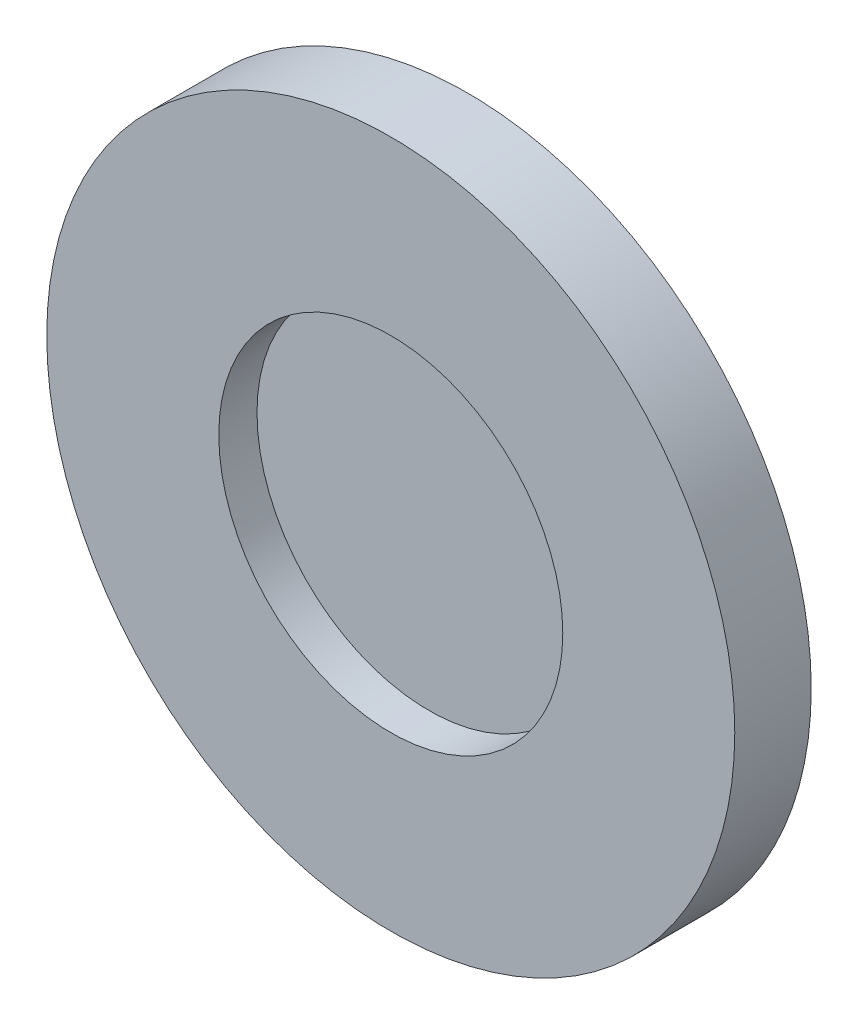
ISO-10303-21;
HEADER;
FILE_DESCRIPTION(('STEP AP214'),'2;1');
FILE_NAME('part.step','',(''),(''),'','','');
FILE_SCHEMA(('AUTOMOTIVE_DESIGN { 1 0 10303 214 1 1 1 1 }'));
ENDSEC;
DATA;
#1=APPLICATION_CONTEXT('core data for automotive mechanical design processes');
#2=APPLICATION_PROTOCOL_DEFINITION('international standard','automotive_design',2000,#1);
#3=PRODUCT_CONTEXT('',#1,'mechanical');
#4=PRODUCT('Part','Part','',(#3));
#5=PRODUCT_RELATED_PRODUCT_CATEGORY('part','',(#4));
#6=PRODUCT_DEFINITION_FORMATION('','',#4);
#7=PRODUCT_DEFINITION_CONTEXT('part definition',#1,'design');
#8=PRODUCT_DEFINITION('design','',#6,#7);
#9=PRODUCT_DEFINITION_SHAPE('','',#8);
#10=(LENGTH_UNIT() NAMED_UNIT(*) SI_UNIT(.MILLI.,.METRE.));
#11=(NAMED_UNIT(*) PLANE_ANGLE_UNIT() SI_UNIT($,.RADIAN.));
#12=(NAMED_UNIT(*) SI_UNIT($,.STERADIAN.) SOLID_ANGLE_UNIT());
#13=UNCERTAINTY_MEASURE_WITH_UNIT(LENGTH_MEASURE(1.E-05),#10,'distance_accuracy_value','');
#14=(GEOMETRIC_REPRESENTATION_CONTEXT(3) GLOBAL_UNCERTAINTY_ASSIGNED_CONTEXT((#13)) GLOBAL_UNIT_ASSIGNED_CONTEXT((#10,
#11,#12)) REPRESENTATION_CONTEXT('',''));
#15=CARTESIAN_POINT('',(0.,0.,0.));
#16=DIRECTION('',(0.,0.,1.));
#17=DIRECTION('',(1.,0.,0.));
#18=AXIS2_PLACEMENT_3D('',#15,#16,#17);
#19=CARTESIAN_POINT('',(0.,0.,10.));
#20=DIRECTION('',(0.,0.,-1.));
#21=DIRECTION('',(-1.,0.,0.));
#22=AXIS2_PLACEMENT_3D('',#19,#20,#21);
#23=CYLINDRICAL_SURFACE('',#22,90.);
#24=CARTESIAN_POINT('',(0.,0.,0.));
#25=DIRECTION('',(0.,0.,1.));
#26=DIRECTION('',(1.,0.,0.));
#27=AXIS2_PLACEMENT_3D('',#24,#25,#26);
#28=CIRCLE('',#27,90.);
#29=CARTESIAN_POINT('',(90.,0.,0.));
#30=VERTEX_POINT('',#29);
#31=EDGE_CURVE('E42',#30,#30,#28,.T.);
#32=ORIENTED_EDGE('',*,*,#31,.T.);
#33=EDGE_LOOP('',(#32));
#34=FACE_BOUND('',#33,.T.);
#35=CARTESIAN_POINT('',(0.,0.,20.));
#36=DIRECTION('',(0.,0.,1.));
#37=DIRECTION('',(1.,0.,0.));
#38=AXIS2_PLACEMENT_3D('',#35,#36,#37);
#39=CIRCLE('',#38,90.);
#40=CARTESIAN_POINT('',(90.,0.,20.));
#41=VERTEX_POINT('',#40);
#42=EDGE_CURVE('E46',#41,#41,#39,.T.);
#43=ORIENTED_EDGE('',*,*,#42,.F.);
#44=EDGE_LOOP('',(#43));
#45=FACE_BOUND('',#44,.T.);
#46=ADVANCED_FACE('F36',(#34,#45),#23,.T.);
#47=CARTESIAN_POINT('',(0.,0.,0.));
#48=DIRECTION('',(0.,0.,1.));
#49=DIRECTION('',(1.,0.,0.));
#50=AXIS2_PLACEMENT_3D('',#47,#48,#49);
#51=PLANE('',#50);
#52=ORIENTED_EDGE('',*,*,#31,.F.);
#53=EDGE_LOOP('',(#52));
#54=FACE_BOUND('',#53,.T.);
#55=ADVANCED_FACE('F60',(#54),#51,.F.);
#56=CARTESIAN_POINT('',(0.,0.,20.));
#57=DIRECTION('',(0.,0.,1.));
#58=DIRECTION('',(1.,0.,0.));
#59=AXIS2_PLACEMENT_3D('',#56,#57,#58);
#60=PLANE('',#59);
#61=ORIENTED_EDGE('',*,*,#42,.T.);
#62=EDGE_LOOP('',(#61));
#63=FACE_BOUND('',#62,.T.);
#64=CARTESIAN_POINT('',(0.,0.,20.));
#65=DIRECTION('',(0.,0.,1.));
#66=DIRECTION('',(1.,0.,0.));
#67=AXIS2_PLACEMENT_3D('',#64,#65,#66);
#68=CIRCLE('',#67,45.);
#69=CARTESIAN_POINT('',(45.,0.,20.));
#70=VERTEX_POINT('',#69);
#71=EDGE_CURVE('E50',#70,#70,#68,.T.);
#72=ORIENTED_EDGE('',*,*,#71,.F.);
#73=EDGE_LOOP('',(#72));
#74=FACE_BOUND('',#73,.T.);
#75=ADVANCED_FACE('F58',(#63,#74),#60,.T.);
#76=CARTESIAN_POINT('',(0.,0.,20.));
#77=DIRECTION('',(0.,0.,-1.));
#78=DIRECTION('',(-1.,0.,0.));
#79=AXIS2_PLACEMENT_3D('',#76,#77,#78);
#80=CYLINDRICAL_SURFACE('',#79,45.);
#81=ORIENTED_EDGE('',*,*,#71,.T.);
#82=EDGE_LOOP('',(#81));
#83=FACE_BOUND('',#82,.T.);
#84=CARTESIAN_POINT('',(0.,0.,10.));
#85=DIRECTION('',(0.,0.,1.));
#86=DIRECTION('',(1.,0.,0.));
#87=AXIS2_PLACEMENT_3D('',#84,#85,#86);
#88=CIRCLE('',#87,45.);
#89=CARTESIAN_POINT('',(45.,0.,10.));
#90=VERTEX_POINT('',#89);
#91=EDGE_CURVE('E10',#90,#90,#88,.F.);
#92=ORIENTED_EDGE('',*,*,#91,.T.);
#93=EDGE_LOOP('',(#92));
#94=FACE_BOUND('',#93,.T.);
#95=ADVANCED_FACE('F56',(#83,#94),#80,.F.);
#96=CARTESIAN_POINT('',(0.,0.,10.));
#97=DIRECTION('',(0.,0.,1.));
#98=DIRECTION('',(1.,0.,0.));
#99=AXIS2_PLACEMENT_3D('',#96,#97,#98);
#100=PLANE('',#99);
#101=ORIENTED_EDGE('',*,*,#91,.F.);
#102=EDGE_LOOP('',(#101));
#103=FACE_BOUND('',#102,.T.);
#104=ADVANCED_FACE('F67',(#103),#100,.T.);
#105=CLOSED_SHELL('',(#46,#55,#75,#95,#104));
#106=MANIFOLD_SOLID_BREP('B2',#105);
#107=ADVANCED_BREP_SHAPE_REPRESENTATION('',(#18,#106),#14);
#108=SHAPE_DEFINITION_REPRESENTATION(#9,#107);
ENDSEC;
END-ISO-10303-21;
